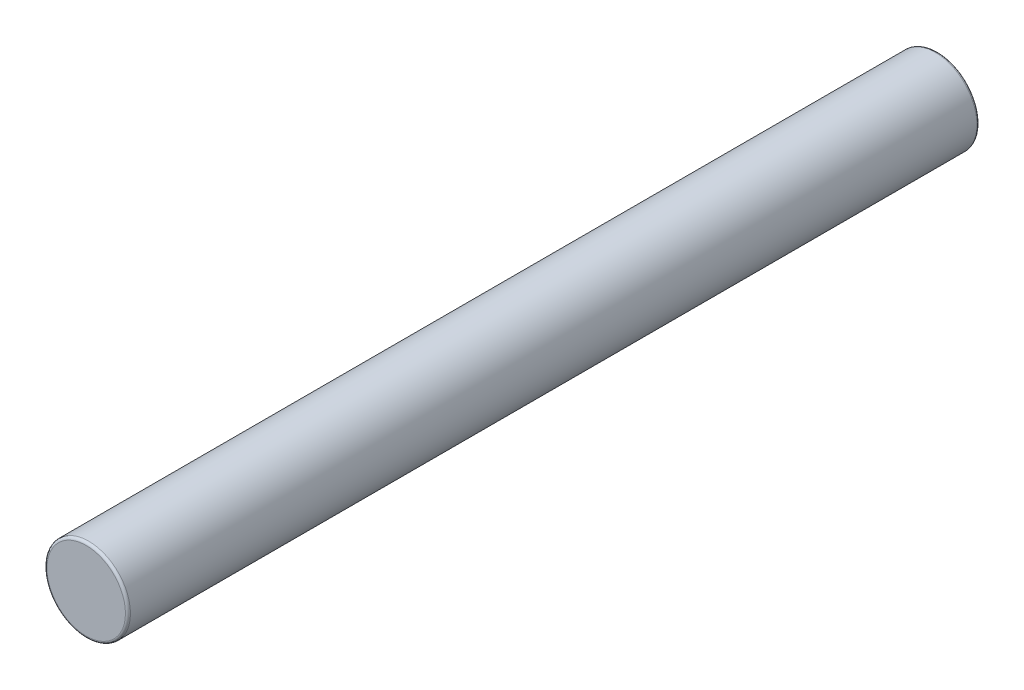
ISO-10303-21;
HEADER;
FILE_DESCRIPTION(('STEP AP214'),'2;1');
FILE_NAME('part.step','',(''),(''),'','','');
FILE_SCHEMA(('AUTOMOTIVE_DESIGN { 1 0 10303 214 1 1 1 1 }'));
ENDSEC;
DATA;
#1=APPLICATION_CONTEXT('core data for automotive mechanical design processes');
#2=APPLICATION_PROTOCOL_DEFINITION('international standard','automotive_design',2000,#1);
#3=PRODUCT_CONTEXT('',#1,'mechanical');
#4=PRODUCT('Part','Part','',(#3));
#5=PRODUCT_RELATED_PRODUCT_CATEGORY('part','',(#4));
#6=PRODUCT_DEFINITION_FORMATION('','',#4);
#7=PRODUCT_DEFINITION_CONTEXT('part definition',#1,'design');
#8=PRODUCT_DEFINITION('design','',#6,#7);
#9=PRODUCT_DEFINITION_SHAPE('','',#8);
#10=(LENGTH_UNIT() NAMED_UNIT(*) SI_UNIT(.MILLI.,.METRE.));
#11=(NAMED_UNIT(*) PLANE_ANGLE_UNIT() SI_UNIT($,.RADIAN.));
#12=(NAMED_UNIT(*) SI_UNIT($,.STERADIAN.) SOLID_ANGLE_UNIT());
#13=UNCERTAINTY_MEASURE_WITH_UNIT(LENGTH_MEASURE(1.E-05),#10,'distance_accuracy_value','');
#14=(GEOMETRIC_REPRESENTATION_CONTEXT(3) GLOBAL_UNCERTAINTY_ASSIGNED_CONTEXT((#13)) GLOBAL_UNIT_ASSIGNED_CONTEXT((#10,
#11,#12)) REPRESENTATION_CONTEXT('',''));
#15=CARTESIAN_POINT('',(0.,0.,0.));
#16=DIRECTION('',(0.,0.,1.));
#17=DIRECTION('',(1.,0.,0.));
#18=AXIS2_PLACEMENT_3D('',#15,#16,#17);
#19=CARTESIAN_POINT('',(0.,0.,51.));
#20=DIRECTION('',(0.,0.,-1.));
#21=DIRECTION('',(-1.,0.,0.));
#22=AXIS2_PLACEMENT_3D('',#19,#20,#21);
#23=CYLINDRICAL_SURFACE('',#22,5.);
#24=CARTESIAN_POINT('',(0.,0.,-50.7));
#25=DIRECTION('',(0.,0.,1.));
#26=DIRECTION('',(1.,0.,0.));
#27=AXIS2_PLACEMENT_3D('',#24,#25,#26);
#28=CIRCLE('',#27,5.);
#29=CARTESIAN_POINT('',(5.,0.,-50.7));
#30=VERTEX_POINT('',#29);
#31=EDGE_CURVE('E50',#30,#30,#28,.T.);
#32=ORIENTED_EDGE('',*,*,#31,.T.);
#33=EDGE_LOOP('',(#32));
#34=FACE_BOUND('',#33,.T.);
#35=CARTESIAN_POINT('',(0.,0.,50.7));
#36=DIRECTION('',(0.,0.,1.));
#37=DIRECTION('',(1.,0.,0.));
#38=AXIS2_PLACEMENT_3D('',#35,#36,#37);
#39=CIRCLE('',#38,5.);
#40=CARTESIAN_POINT('',(5.,0.,50.7));
#41=VERTEX_POINT('',#40);
#42=EDGE_CURVE('E55',#41,#41,#39,.F.);
#43=ORIENTED_EDGE('',*,*,#42,.T.);
#44=EDGE_LOOP('',(#43));
#45=FACE_BOUND('',#44,.T.);
#46=ADVANCED_FACE('F37',(#34,#45),#23,.T.);
#47=CARTESIAN_POINT('',(0.,0.,51.));
#48=DIRECTION('',(0.,0.,1.));
#49=DIRECTION('',(1.,0.,0.));
#50=AXIS2_PLACEMENT_3D('',#47,#48,#49);
#51=PLANE('',#50);
#52=CARTESIAN_POINT('',(0.,0.,51.));
#53=DIRECTION('',(0.,0.,1.));
#54=DIRECTION('',(1.,0.,0.));
#55=AXIS2_PLACEMENT_3D('',#52,#53,#54);
#56=CIRCLE('',#55,4.7);
#57=CARTESIAN_POINT('',(4.7,0.,51.));
#58=VERTEX_POINT('',#57);
#59=EDGE_CURVE('E10',#58,#58,#56,.T.);
#60=ORIENTED_EDGE('',*,*,#59,.T.);
#61=EDGE_LOOP('',(#60));
#62=FACE_BOUND('',#61,.T.);
#63=ADVANCED_FACE('F72',(#62),#51,.T.);
#64=CARTESIAN_POINT('',(0.,0.,-51.));
#65=DIRECTION('',(0.,0.,1.));
#66=DIRECTION('',(1.,0.,0.));
#67=AXIS2_PLACEMENT_3D('',#64,#65,#66);
#68=PLANE('',#67);
#69=CARTESIAN_POINT('',(0.,0.,-51.));
#70=DIRECTION('',(0.,0.,1.));
#71=DIRECTION('',(1.,0.,0.));
#72=AXIS2_PLACEMENT_3D('',#69,#70,#71);
#73=CIRCLE('',#72,4.7);
#74=CARTESIAN_POINT('',(4.7,0.,-51.));
#75=VERTEX_POINT('',#74);
#76=EDGE_CURVE('E45',#75,#75,#73,.F.);
#77=ORIENTED_EDGE('',*,*,#76,.T.);
#78=EDGE_LOOP('',(#77));
#79=FACE_BOUND('',#78,.T.);
#80=ADVANCED_FACE('F69',(#79),#68,.F.);
#81=CARTESIAN_POINT('',(0.,0.,-50.7));
#82=DIRECTION('',(0.,0.,1.));
#83=DIRECTION('',(1.,0.,0.));
#84=AXIS2_PLACEMENT_3D('',#81,#82,#83);
#85=TOROIDAL_SURFACE('',#84,4.7,0.3);
#86=ORIENTED_EDGE('',*,*,#76,.F.);
#87=EDGE_LOOP('',(#86));
#88=FACE_BOUND('',#87,.T.);
#89=ORIENTED_EDGE('',*,*,#31,.F.);
#90=EDGE_LOOP('',(#89));
#91=FACE_BOUND('',#90,.T.);
#92=ADVANCED_FACE('F65',(#88,#91),#85,.T.);
#93=CARTESIAN_POINT('',(0.,0.,50.7));
#94=DIRECTION('',(0.,0.,1.));
#95=DIRECTION('',(1.,0.,0.));
#96=AXIS2_PLACEMENT_3D('',#93,#94,#95);
#97=TOROIDAL_SURFACE('',#96,4.7,0.3);
#98=ORIENTED_EDGE('',*,*,#42,.F.);
#99=EDGE_LOOP('',(#98));
#100=FACE_BOUND('',#99,.T.);
#101=ORIENTED_EDGE('',*,*,#59,.F.);
#102=EDGE_LOOP('',(#101));
#103=FACE_BOUND('',#102,.T.);
#104=ADVANCED_FACE('F39',(#100,#103),#97,.T.);
#105=CLOSED_SHELL('',(#46,#63,#80,#92,#104));
#106=MANIFOLD_SOLID_BREP('B2',#105);
#107=ADVANCED_BREP_SHAPE_REPRESENTATION('',(#18,#106),#14);
#108=SHAPE_DEFINITION_REPRESENTATION(#9,#107);
ENDSEC;
END-ISO-10303-21;
